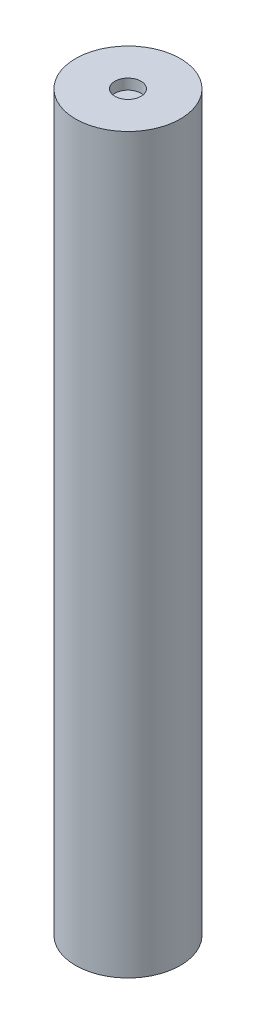
ISO-10303-21;
HEADER;
FILE_DESCRIPTION(('STEP AP214'),'2;1');
FILE_NAME('part.step','',(''),(''),'','','');
FILE_SCHEMA(('AUTOMOTIVE_DESIGN { 1 0 10303 214 1 1 1 1 }'));
ENDSEC;
DATA;
#1=APPLICATION_CONTEXT('core data for automotive mechanical design processes');
#2=APPLICATION_PROTOCOL_DEFINITION('international standard','automotive_design',2000,#1);
#3=PRODUCT_CONTEXT('',#1,'mechanical');
#4=PRODUCT('Part','Part','',(#3));
#5=PRODUCT_RELATED_PRODUCT_CATEGORY('part','',(#4));
#6=PRODUCT_DEFINITION_FORMATION('','',#4);
#7=PRODUCT_DEFINITION_CONTEXT('part definition',#1,'design');
#8=PRODUCT_DEFINITION('design','',#6,#7);
#9=PRODUCT_DEFINITION_SHAPE('','',#8);
#10=(LENGTH_UNIT() NAMED_UNIT(*) SI_UNIT(.MILLI.,.METRE.));
#11=(NAMED_UNIT(*) PLANE_ANGLE_UNIT() SI_UNIT($,.RADIAN.));
#12=(NAMED_UNIT(*) SI_UNIT($,.STERADIAN.) SOLID_ANGLE_UNIT());
#13=UNCERTAINTY_MEASURE_WITH_UNIT(LENGTH_MEASURE(1.E-05),#10,'distance_accuracy_value','');
#14=(GEOMETRIC_REPRESENTATION_CONTEXT(3) GLOBAL_UNCERTAINTY_ASSIGNED_CONTEXT((#13)) GLOBAL_UNIT_ASSIGNED_CONTEXT((#10,
#11,#12)) REPRESENTATION_CONTEXT('',''));
#15=CARTESIAN_POINT('',(0.,0.,0.));
#16=DIRECTION('',(0.,0.,1.));
#17=DIRECTION('',(1.,0.,0.));
#18=AXIS2_PLACEMENT_3D('',#15,#16,#17);
#19=CARTESIAN_POINT('',(0.,177.8,0.));
#20=DIRECTION('',(0.,-1.,0.));
#21=DIRECTION('',(0.,0.,-1.));
#22=AXIS2_PLACEMENT_3D('',#19,#20,#21);
#23=CYLINDRICAL_SURFACE('',#22,12.7);
#24=CARTESIAN_POINT('',(0.,177.8,0.));
#25=DIRECTION('',(0.,1.,0.));
#26=DIRECTION('',(0.,0.,1.));
#27=AXIS2_PLACEMENT_3D('',#24,#25,#26);
#28=CIRCLE('',#27,12.7);
#29=CARTESIAN_POINT('',(0.,177.8,12.7));
#30=VERTEX_POINT('',#29);
#31=EDGE_CURVE('E10',#30,#30,#28,.T.);
#32=ORIENTED_EDGE('',*,*,#31,.F.);
#33=EDGE_LOOP('',(#32));
#34=FACE_BOUND('',#33,.T.);
#35=CARTESIAN_POINT('',(0.,0.,0.));
#36=DIRECTION('',(0.,1.,0.));
#37=DIRECTION('',(0.,0.,1.));
#38=AXIS2_PLACEMENT_3D('',#35,#36,#37);
#39=CIRCLE('',#38,12.7);
#40=CARTESIAN_POINT('',(0.,0.,12.7));
#41=VERTEX_POINT('',#40);
#42=EDGE_CURVE('E34',#41,#41,#39,.T.);
#43=ORIENTED_EDGE('',*,*,#42,.T.);
#44=EDGE_LOOP('',(#43));
#45=FACE_BOUND('',#44,.T.);
#46=ADVANCED_FACE('F31',(#34,#45),#23,.T.);
#47=CARTESIAN_POINT('',(0.,177.8,0.));
#48=DIRECTION('',(0.,1.,0.));
#49=DIRECTION('',(0.,0.,1.));
#50=AXIS2_PLACEMENT_3D('',#47,#48,#49);
#51=PLANE('',#50);
#52=CARTESIAN_POINT('',(0.,177.8,0.));
#53=DIRECTION('',(0.,1.,0.));
#54=DIRECTION('',(0.,0.,1.));
#55=AXIS2_PLACEMENT_3D('',#52,#53,#54);
#56=CIRCLE('',#55,3.175);
#57=CARTESIAN_POINT('',(0.,177.8,3.175));
#58=VERTEX_POINT('',#57);
#59=EDGE_CURVE('E43',#58,#58,#56,.T.);
#60=ORIENTED_EDGE('',*,*,#59,.F.);
#61=EDGE_LOOP('',(#60));
#62=FACE_BOUND('',#61,.T.);
#63=ORIENTED_EDGE('',*,*,#31,.T.);
#64=EDGE_LOOP('',(#63));
#65=FACE_BOUND('',#64,.T.);
#66=ADVANCED_FACE('F68',(#62,#65),#51,.T.);
#67=CARTESIAN_POINT('',(0.,0.,0.));
#68=DIRECTION('',(0.,1.,0.));
#69=DIRECTION('',(0.,0.,1.));
#70=AXIS2_PLACEMENT_3D('',#67,#68,#69);
#71=PLANE('',#70);
#72=CARTESIAN_POINT('',(0.,0.,0.));
#73=DIRECTION('',(0.,-1.,0.));
#74=DIRECTION('',(0.,0.,-1.));
#75=AXIS2_PLACEMENT_3D('',#72,#73,#74);
#76=CIRCLE('',#75,3.175);
#77=CARTESIAN_POINT('',(0.,0.,-3.175));
#78=VERTEX_POINT('',#77);
#79=EDGE_CURVE('E49',#78,#78,#76,.T.);
#80=ORIENTED_EDGE('',*,*,#79,.F.);
#81=EDGE_LOOP('',(#80));
#82=FACE_BOUND('',#81,.T.);
#83=ORIENTED_EDGE('',*,*,#42,.F.);
#84=EDGE_LOOP('',(#83));
#85=FACE_BOUND('',#84,.T.);
#86=ADVANCED_FACE('F64',(#82,#85),#71,.F.);
#87=CARTESIAN_POINT('',(0.,175.26,0.));
#88=DIRECTION('',(0.,1.,0.));
#89=DIRECTION('',(0.,0.,1.));
#90=AXIS2_PLACEMENT_3D('',#87,#88,#89);
#91=CYLINDRICAL_SURFACE('',#90,3.175);
#92=CARTESIAN_POINT('',(0.,175.26,0.));
#93=DIRECTION('',(0.,1.,0.));
#94=DIRECTION('',(0.,0.,1.));
#95=AXIS2_PLACEMENT_3D('',#92,#93,#94);
#96=CIRCLE('',#95,3.175);
#97=CARTESIAN_POINT('',(0.,175.26,3.175));
#98=VERTEX_POINT('',#97);
#99=EDGE_CURVE('E41',#98,#98,#96,.T.);
#100=ORIENTED_EDGE('',*,*,#99,.F.);
#101=EDGE_LOOP('',(#100));
#102=FACE_BOUND('',#101,.T.);
#103=ORIENTED_EDGE('',*,*,#59,.T.);
#104=EDGE_LOOP('',(#103));
#105=FACE_BOUND('',#104,.T.);
#106=ADVANCED_FACE('F67',(#102,#105),#91,.F.);
#107=CARTESIAN_POINT('',(0.,175.26,0.));
#108=DIRECTION('',(0.,1.,0.));
#109=DIRECTION('',(0.,0.,1.));
#110=AXIS2_PLACEMENT_3D('',#107,#108,#109);
#111=PLANE('',#110);
#112=ORIENTED_EDGE('',*,*,#99,.T.);
#113=EDGE_LOOP('',(#112));
#114=FACE_BOUND('',#113,.T.);
#115=ADVANCED_FACE('F60',(#114),#111,.T.);
#116=CARTESIAN_POINT('',(0.,2.54,0.));
#117=DIRECTION('',(0.,-1.,0.));
#118=DIRECTION('',(0.,0.,-1.));
#119=AXIS2_PLACEMENT_3D('',#116,#117,#118);
#120=CYLINDRICAL_SURFACE('',#119,3.175);
#121=CARTESIAN_POINT('',(0.,2.54,0.));
#122=DIRECTION('',(0.,-1.,0.));
#123=DIRECTION('',(0.,0.,-1.));
#124=AXIS2_PLACEMENT_3D('',#121,#122,#123);
#125=CIRCLE('',#124,3.175);
#126=CARTESIAN_POINT('',(0.,2.54,-3.175));
#127=VERTEX_POINT('',#126);
#128=EDGE_CURVE('E46',#127,#127,#125,.T.);
#129=ORIENTED_EDGE('',*,*,#128,.F.);
#130=EDGE_LOOP('',(#129));
#131=FACE_BOUND('',#130,.T.);
#132=ORIENTED_EDGE('',*,*,#79,.T.);
#133=EDGE_LOOP('',(#132));
#134=FACE_BOUND('',#133,.T.);
#135=ADVANCED_FACE('F57',(#131,#134),#120,.F.);
#136=CARTESIAN_POINT('',(0.,2.54,0.));
#137=DIRECTION('',(0.,-1.,0.));
#138=DIRECTION('',(0.,0.,-1.));
#139=AXIS2_PLACEMENT_3D('',#136,#137,#138);
#140=PLANE('',#139);
#141=ORIENTED_EDGE('',*,*,#128,.T.);
#142=EDGE_LOOP('',(#141));
#143=FACE_BOUND('',#142,.T.);
#144=ADVANCED_FACE('F55',(#143),#140,.T.);
#145=CLOSED_SHELL('',(#46,#66,#86,#106,#115,#135,#144));
#146=MANIFOLD_SOLID_BREP('B2',#145);
#147=ADVANCED_BREP_SHAPE_REPRESENTATION('',(#18,#146),#14);
#148=SHAPE_DEFINITION_REPRESENTATION(#9,#147);
ENDSEC;
END-ISO-10303-21;
